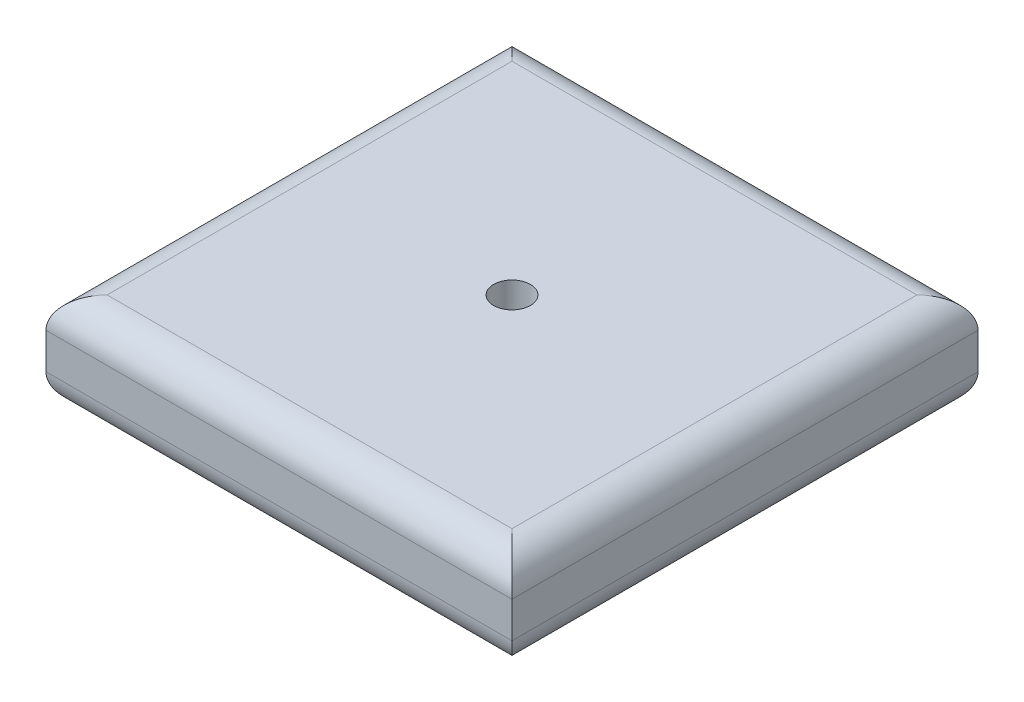
ISO-10303-21;
HEADER;
FILE_DESCRIPTION(('STEP AP214'),'2;1');
FILE_NAME('part.step','',(''),(''),'','','');
FILE_SCHEMA(('AUTOMOTIVE_DESIGN { 1 0 10303 214 1 1 1 1 }'));
ENDSEC;
DATA;
#1=APPLICATION_CONTEXT('core data for automotive mechanical design processes');
#2=APPLICATION_PROTOCOL_DEFINITION('international standard','automotive_design',2000,#1);
#3=PRODUCT_CONTEXT('',#1,'mechanical');
#4=PRODUCT('Part','Part','',(#3));
#5=PRODUCT_RELATED_PRODUCT_CATEGORY('part','',(#4));
#6=PRODUCT_DEFINITION_FORMATION('','',#4);
#7=PRODUCT_DEFINITION_CONTEXT('part definition',#1,'design');
#8=PRODUCT_DEFINITION('design','',#6,#7);
#9=PRODUCT_DEFINITION_SHAPE('','',#8);
#10=(LENGTH_UNIT() NAMED_UNIT(*) SI_UNIT(.MILLI.,.METRE.));
#11=(NAMED_UNIT(*) PLANE_ANGLE_UNIT() SI_UNIT($,.RADIAN.));
#12=(NAMED_UNIT(*) SI_UNIT($,.STERADIAN.) SOLID_ANGLE_UNIT());
#13=UNCERTAINTY_MEASURE_WITH_UNIT(LENGTH_MEASURE(1.E-05),#10,'distance_accuracy_value','');
#14=(GEOMETRIC_REPRESENTATION_CONTEXT(3) GLOBAL_UNCERTAINTY_ASSIGNED_CONTEXT((#13)) GLOBAL_UNIT_ASSIGNED_CONTEXT((#10,
#11,#12)) REPRESENTATION_CONTEXT('',''));
#15=CARTESIAN_POINT('',(0.,0.,0.));
#16=DIRECTION('',(0.,0.,1.));
#17=DIRECTION('',(1.,0.,0.));
#18=AXIS2_PLACEMENT_3D('',#15,#16,#17);
#19=CARTESIAN_POINT('',(-33.7530201342282,31.75,-152.4));
#20=DIRECTION('',(1.,0.,0.));
#21=DIRECTION('',(0.,0.,-1.));
#22=AXIS2_PLACEMENT_3D('',#19,#20,#21);
#23=PLANE('',#22);
#24=DIRECTION('',(0.,-1.,0.));
#25=VECTOR('',#24,1.);
#26=CARTESIAN_POINT('',(-33.7530201342282,31.75,-152.4));
#27=LINE('',#26,#25);
#28=CARTESIAN_POINT('',(-33.7530201342282,21.75,-152.4));
#29=VERTEX_POINT('',#28);
#30=CARTESIAN_POINT('',(-33.7530201342282,10.,-152.4));
#31=VERTEX_POINT('',#30);
#32=EDGE_CURVE('E222',#29,#31,#27,.T.);
#33=ORIENTED_EDGE('',*,*,#32,.T.);
#34=DIRECTION('',(0.,0.,1.));
#35=VECTOR('',#34,1.);
#36=CARTESIAN_POINT('',(-33.7530201342282,10.,-152.4));
#37=LINE('',#36,#35);
#38=CARTESIAN_POINT('',(-33.7530201342282,10.,0.));
#39=VERTEX_POINT('',#38);
#40=EDGE_CURVE('E64',#31,#39,#37,.T.);
#41=ORIENTED_EDGE('',*,*,#40,.T.);
#42=DIRECTION('',(0.,-1.,0.));
#43=VECTOR('',#42,1.);
#44=CARTESIAN_POINT('',(-33.7530201342282,31.75,0.));
#45=LINE('',#44,#43);
#46=CARTESIAN_POINT('',(-33.7530201342282,21.75,0.));
#47=VERTEX_POINT('',#46);
#48=EDGE_CURVE('E137',#47,#39,#45,.T.);
#49=ORIENTED_EDGE('',*,*,#48,.F.);
#50=DIRECTION('',(0.,0.,1.));
#51=VECTOR('',#50,1.);
#52=CARTESIAN_POINT('',(-33.7530201342282,21.75,-152.4));
#53=LINE('',#52,#51);
#54=EDGE_CURVE('E153',#47,#29,#53,.F.);
#55=ORIENTED_EDGE('',*,*,#54,.T.);
#56=EDGE_LOOP('',(#33,#41,#49,#55));
#57=FACE_BOUND('',#56,.T.);
#58=ADVANCED_FACE('F39',(#57),#23,.F.);
#59=CARTESIAN_POINT('',(-33.7530201342282,31.75,0.));
#60=DIRECTION('',(0.,0.,-1.));
#61=DIRECTION('',(-1.,0.,0.));
#62=AXIS2_PLACEMENT_3D('',#59,#60,#61);
#63=PLANE('',#62);
#64=ORIENTED_EDGE('',*,*,#48,.T.);
#65=DIRECTION('',(1.,0.,0.));
#66=VECTOR('',#65,1.);
#67=CARTESIAN_POINT('',(-33.7530201342282,10.,0.));
#68=LINE('',#67,#66);
#69=CARTESIAN_POINT('',(118.646979865772,10.,0.));
#70=VERTEX_POINT('',#69);
#71=EDGE_CURVE('E49',#39,#70,#68,.T.);
#72=ORIENTED_EDGE('',*,*,#71,.T.);
#73=DIRECTION('',(0.,-1.,0.));
#74=VECTOR('',#73,1.);
#75=CARTESIAN_POINT('',(118.646979865772,31.75,0.));
#76=LINE('',#75,#74);
#77=CARTESIAN_POINT('',(118.646979865772,21.75,0.));
#78=VERTEX_POINT('',#77);
#79=EDGE_CURVE('E140',#78,#70,#76,.T.);
#80=ORIENTED_EDGE('',*,*,#79,.F.);
#81=DIRECTION('',(1.,0.,0.));
#82=VECTOR('',#81,1.);
#83=CARTESIAN_POINT('',(-33.7530201342282,21.75,0.));
#84=LINE('',#83,#82);
#85=EDGE_CURVE('E126',#78,#47,#84,.F.);
#86=ORIENTED_EDGE('',*,*,#85,.T.);
#87=EDGE_LOOP('',(#64,#72,#80,#86));
#88=FACE_BOUND('',#87,.T.);
#89=ADVANCED_FACE('F239',(#88),#63,.F.);
#90=CARTESIAN_POINT('',(118.646979865772,31.75,-152.4));
#91=DIRECTION('',(-1.,0.,0.));
#92=DIRECTION('',(0.,0.,1.));
#93=AXIS2_PLACEMENT_3D('',#90,#91,#92);
#94=PLANE('',#93);
#95=ORIENTED_EDGE('',*,*,#79,.T.);
#96=DIRECTION('',(0.,0.,-1.));
#97=VECTOR('',#96,1.);
#98=CARTESIAN_POINT('',(118.646979865772,10.,-152.4));
#99=LINE('',#98,#97);
#100=CARTESIAN_POINT('',(118.646979865772,10.,-152.4));
#101=VERTEX_POINT('',#100);
#102=EDGE_CURVE('E11',#70,#101,#99,.T.);
#103=ORIENTED_EDGE('',*,*,#102,.T.);
#104=DIRECTION('',(0.,-1.,0.));
#105=VECTOR('',#104,1.);
#106=CARTESIAN_POINT('',(118.646979865772,31.75,-152.4));
#107=LINE('',#106,#105);
#108=CARTESIAN_POINT('',(118.646979865772,21.75,-152.4));
#109=VERTEX_POINT('',#108);
#110=EDGE_CURVE('E225',#109,#101,#107,.T.);
#111=ORIENTED_EDGE('',*,*,#110,.F.);
#112=DIRECTION('',(0.,0.,-1.));
#113=VECTOR('',#112,1.);
#114=CARTESIAN_POINT('',(118.646979865772,21.75,0.));
#115=LINE('',#114,#113);
#116=EDGE_CURVE('E158',#109,#78,#115,.F.);
#117=ORIENTED_EDGE('',*,*,#116,.T.);
#118=EDGE_LOOP('',(#95,#103,#111,#117));
#119=FACE_BOUND('',#118,.T.);
#120=ADVANCED_FACE('F238',(#119),#94,.F.);
#121=CARTESIAN_POINT('',(-33.7530201342282,31.75,-152.4));
#122=DIRECTION('',(0.,0.,1.));
#123=DIRECTION('',(1.,0.,0.));
#124=AXIS2_PLACEMENT_3D('',#121,#122,#123);
#125=PLANE('',#124);
#126=ORIENTED_EDGE('',*,*,#110,.T.);
#127=DIRECTION('',(-1.,0.,0.));
#128=VECTOR('',#127,1.);
#129=CARTESIAN_POINT('',(-33.7530201342282,10.,-152.4));
#130=LINE('',#129,#128);
#131=EDGE_CURVE('E161',#101,#31,#130,.T.);
#132=ORIENTED_EDGE('',*,*,#131,.T.);
#133=ORIENTED_EDGE('',*,*,#32,.F.);
#134=DIRECTION('',(-1.,0.,0.));
#135=VECTOR('',#134,1.);
#136=CARTESIAN_POINT('',(118.646979865772,21.75,-152.4));
#137=LINE('',#136,#135);
#138=EDGE_CURVE('E149',#29,#109,#137,.F.);
#139=ORIENTED_EDGE('',*,*,#138,.T.);
#140=EDGE_LOOP('',(#126,#132,#133,#139));
#141=FACE_BOUND('',#140,.T.);
#142=ADVANCED_FACE('F221',(#141),#125,.F.);
#143=CARTESIAN_POINT('',(0.,31.75,0.));
#144=DIRECTION('',(0.,1.,0.));
#145=DIRECTION('',(0.,0.,1.));
#146=AXIS2_PLACEMENT_3D('',#143,#144,#145);
#147=PLANE('',#146);
#148=DIRECTION('',(0.,0.,-1.));
#149=VECTOR('',#148,1.);
#150=CARTESIAN_POINT('',(108.646979865772,31.75,-152.4));
#151=LINE('',#150,#149);
#152=CARTESIAN_POINT('',(108.646979865772,31.75,-10.));
#153=VERTEX_POINT('',#152);
#154=CARTESIAN_POINT('',(108.646979865772,31.75,-142.4));
#155=VERTEX_POINT('',#154);
#156=EDGE_CURVE('E113',#153,#155,#151,.T.);
#157=ORIENTED_EDGE('',*,*,#156,.T.);
#158=DIRECTION('',(-1.,0.,0.));
#159=VECTOR('',#158,1.);
#160=CARTESIAN_POINT('',(-33.7530201342282,31.75,-142.4));
#161=LINE('',#160,#159);
#162=CARTESIAN_POINT('',(-23.7530201342282,31.75,-142.4));
#163=VERTEX_POINT('',#162);
#164=EDGE_CURVE('E146',#155,#163,#161,.T.);
#165=ORIENTED_EDGE('',*,*,#164,.T.);
#166=DIRECTION('',(0.,0.,1.));
#167=VECTOR('',#166,1.);
#168=CARTESIAN_POINT('',(-23.7530201342281,31.75,0.));
#169=LINE('',#168,#167);
#170=CARTESIAN_POINT('',(-23.7530201342281,31.75,-10.));
#171=VERTEX_POINT('',#170);
#172=EDGE_CURVE('E116',#163,#171,#169,.T.);
#173=ORIENTED_EDGE('',*,*,#172,.T.);
#174=DIRECTION('',(1.,0.,0.));
#175=VECTOR('',#174,1.);
#176=CARTESIAN_POINT('',(118.646979865772,31.75,-10.));
#177=LINE('',#176,#175);
#178=EDGE_CURVE('E107',#171,#153,#177,.T.);
#179=ORIENTED_EDGE('',*,*,#178,.T.);
#180=EDGE_LOOP('',(#157,#165,#173,#179));
#181=FACE_BOUND('',#180,.T.);
#182=CARTESIAN_POINT('',(42.4469798657718,31.75,-76.2));
#183=DIRECTION('',(0.,1.,0.));
#184=DIRECTION('',(0.,0.,1.));
#185=AXIS2_PLACEMENT_3D('',#182,#183,#184);
#186=CIRCLE('',#185,6.);
#187=CARTESIAN_POINT('',(42.4469798657718,31.75,-70.2));
#188=VERTEX_POINT('',#187);
#189=EDGE_CURVE('E130',#188,#188,#186,.T.);
#190=ORIENTED_EDGE('',*,*,#189,.F.);
#191=EDGE_LOOP('',(#190));
#192=FACE_BOUND('',#191,.T.);
#193=ADVANCED_FACE('F109',(#181,#192),#147,.T.);
#194=CARTESIAN_POINT('',(0.,0.,0.));
#195=DIRECTION('',(0.,1.,0.));
#196=DIRECTION('',(0.,0.,1.));
#197=AXIS2_PLACEMENT_3D('',#194,#195,#196);
#198=PLANE('',#197);
#199=DIRECTION('',(0.,0.,1.));
#200=VECTOR('',#199,1.);
#201=CARTESIAN_POINT('',(-23.7530201342281,0.,0.));
#202=LINE('',#201,#200);
#203=CARTESIAN_POINT('',(-23.7530201342281,0.,-10.));
#204=VERTEX_POINT('',#203);
#205=CARTESIAN_POINT('',(-23.7530201342282,0.,-142.4));
#206=VERTEX_POINT('',#205);
#207=EDGE_CURVE('E178',#204,#206,#202,.F.);
#208=ORIENTED_EDGE('',*,*,#207,.T.);
#209=DIRECTION('',(-1.,0.,0.));
#210=VECTOR('',#209,1.);
#211=CARTESIAN_POINT('',(0.,0.,-142.4));
#212=LINE('',#211,#210);
#213=CARTESIAN_POINT('',(108.646979865772,0.,-142.4));
#214=VERTEX_POINT('',#213);
#215=EDGE_CURVE('E181',#206,#214,#212,.F.);
#216=ORIENTED_EDGE('',*,*,#215,.T.);
#217=DIRECTION('',(0.,0.,-1.));
#218=VECTOR('',#217,1.);
#219=CARTESIAN_POINT('',(108.646979865772,0.,0.));
#220=LINE('',#219,#218);
#221=CARTESIAN_POINT('',(108.646979865772,0.,-10.));
#222=VERTEX_POINT('',#221);
#223=EDGE_CURVE('E172',#214,#222,#220,.F.);
#224=ORIENTED_EDGE('',*,*,#223,.T.);
#225=DIRECTION('',(1.,0.,0.));
#226=VECTOR('',#225,1.);
#227=CARTESIAN_POINT('',(0.,0.,-10.));
#228=LINE('',#227,#226);
#229=EDGE_CURVE('E175',#222,#204,#228,.F.);
#230=ORIENTED_EDGE('',*,*,#229,.T.);
#231=EDGE_LOOP('',(#208,#216,#224,#230));
#232=FACE_BOUND('',#231,.T.);
#233=ADVANCED_FACE('F211',(#232),#198,.F.);
#234=CARTESIAN_POINT('',(42.4469798657718,16.75,-76.2));
#235=DIRECTION('',(0.,1.,0.));
#236=DIRECTION('',(0.,0.,1.));
#237=AXIS2_PLACEMENT_3D('',#234,#235,#236);
#238=CYLINDRICAL_SURFACE('',#237,6.);
#239=CARTESIAN_POINT('',(42.4469798657718,16.75,-76.2));
#240=DIRECTION('',(0.,1.,0.));
#241=DIRECTION('',(0.,0.,1.));
#242=AXIS2_PLACEMENT_3D('',#239,#240,#241);
#243=CIRCLE('',#242,6.);
#244=CARTESIAN_POINT('',(42.4469798657718,16.75,-70.2));
#245=VERTEX_POINT('',#244);
#246=EDGE_CURVE('E228',#245,#245,#243,.T.);
#247=ORIENTED_EDGE('',*,*,#246,.F.);
#248=EDGE_LOOP('',(#247));
#249=FACE_BOUND('',#248,.T.);
#250=ORIENTED_EDGE('',*,*,#189,.T.);
#251=EDGE_LOOP('',(#250));
#252=FACE_BOUND('',#251,.T.);
#253=ADVANCED_FACE('F265',(#249,#252),#238,.F.);
#254=CARTESIAN_POINT('',(42.4469798657718,16.75,-76.2));
#255=DIRECTION('',(0.,1.,0.));
#256=DIRECTION('',(0.,0.,1.));
#257=AXIS2_PLACEMENT_3D('',#254,#255,#256);
#258=PLANE('',#257);
#259=ORIENTED_EDGE('',*,*,#246,.T.);
#260=EDGE_LOOP('',(#259));
#261=FACE_BOUND('',#260,.T.);
#262=ADVANCED_FACE('F270',(#261),#258,.T.);
#263=CARTESIAN_POINT('',(0.,21.75,-10.));
#264=DIRECTION('',(-1.,0.,0.));
#265=DIRECTION('',(0.,0.,1.));
#266=AXIS2_PLACEMENT_3D('',#263,#264,#265);
#267=CYLINDRICAL_SURFACE('',#266,10.);
#268=CARTESIAN_POINT('',(-23.7530201342281,21.75,-10.));
#269=DIRECTION('',(-0.707106781186547,0.,-0.707106781186547));
#270=DIRECTION('',(-0.707106781186547,0.,0.707106781186548));
#271=AXIS2_PLACEMENT_3D('',#268,#269,#270);
#272=ELLIPSE('',#271,14.1421356237309,10.);
#273=EDGE_CURVE('E131',#47,#171,#272,.T.);
#274=ORIENTED_EDGE('',*,*,#273,.F.);
#275=ORIENTED_EDGE('',*,*,#85,.F.);
#276=CARTESIAN_POINT('',(108.646979865772,21.75,-10.));
#277=DIRECTION('',(-0.707106781186547,0.,0.707106781186547));
#278=DIRECTION('',(0.707106781186547,0.,0.707106781186547));
#279=AXIS2_PLACEMENT_3D('',#276,#277,#278);
#280=ELLIPSE('',#279,14.1421356237309,10.);
#281=EDGE_CURVE('E124',#153,#78,#280,.F.);
#282=ORIENTED_EDGE('',*,*,#281,.F.);
#283=ORIENTED_EDGE('',*,*,#178,.F.);
#284=EDGE_LOOP('',(#274,#275,#282,#283));
#285=FACE_BOUND('',#284,.T.);
#286=ADVANCED_FACE('F125',(#285),#267,.T.);
#287=CARTESIAN_POINT('',(108.646979865772,21.75,0.));
#288=DIRECTION('',(0.,0.,1.));
#289=DIRECTION('',(1.,0.,0.));
#290=AXIS2_PLACEMENT_3D('',#287,#288,#289);
#291=CYLINDRICAL_SURFACE('',#290,10.);
#292=ORIENTED_EDGE('',*,*,#281,.T.);
#293=ORIENTED_EDGE('',*,*,#116,.F.);
#294=CARTESIAN_POINT('',(108.646979865772,21.75,-142.4));
#295=DIRECTION('',(0.707106781186547,0.,0.707106781186547));
#296=DIRECTION('',(-0.707106781186547,0.,0.707106781186547));
#297=AXIS2_PLACEMENT_3D('',#294,#295,#296);
#298=ELLIPSE('',#297,14.1421356237309,10.);
#299=EDGE_CURVE('E134',#155,#109,#298,.F.);
#300=ORIENTED_EDGE('',*,*,#299,.F.);
#301=ORIENTED_EDGE('',*,*,#156,.F.);
#302=EDGE_LOOP('',(#292,#293,#300,#301));
#303=FACE_BOUND('',#302,.T.);
#304=ADVANCED_FACE('F133',(#303),#291,.T.);
#305=CARTESIAN_POINT('',(-23.7530201342281,21.75,0.));
#306=DIRECTION('',(0.,0.,-1.));
#307=DIRECTION('',(-1.,0.,0.));
#308=AXIS2_PLACEMENT_3D('',#305,#306,#307);
#309=CYLINDRICAL_SURFACE('',#308,10.);
#310=ORIENTED_EDGE('',*,*,#273,.T.);
#311=ORIENTED_EDGE('',*,*,#172,.F.);
#312=CARTESIAN_POINT('',(-23.7530201342282,21.75,-142.4));
#313=DIRECTION('',(0.707106781186547,0.,-0.707106781186548));
#314=DIRECTION('',(-0.707106781186547,0.,-0.707106781186547));
#315=AXIS2_PLACEMENT_3D('',#312,#313,#314);
#316=ELLIPSE('',#315,14.142135623731,10.);
#317=EDGE_CURVE('E162',#29,#163,#316,.T.);
#318=ORIENTED_EDGE('',*,*,#317,.F.);
#319=ORIENTED_EDGE('',*,*,#54,.F.);
#320=EDGE_LOOP('',(#310,#311,#318,#319));
#321=FACE_BOUND('',#320,.T.);
#322=ADVANCED_FACE('F242',(#321),#309,.T.);
#323=CARTESIAN_POINT('',(0.,21.75,-142.4));
#324=DIRECTION('',(1.,0.,0.));
#325=DIRECTION('',(0.,0.,-1.));
#326=AXIS2_PLACEMENT_3D('',#323,#324,#325);
#327=CYLINDRICAL_SURFACE('',#326,10.);
#328=ORIENTED_EDGE('',*,*,#299,.T.);
#329=ORIENTED_EDGE('',*,*,#138,.F.);
#330=ORIENTED_EDGE('',*,*,#317,.T.);
#331=ORIENTED_EDGE('',*,*,#164,.F.);
#332=EDGE_LOOP('',(#328,#329,#330,#331));
#333=FACE_BOUND('',#332,.T.);
#334=ADVANCED_FACE('F244',(#333),#327,.T.);
#335=CARTESIAN_POINT('',(-33.7530201342282,10.,-10.));
#336=DIRECTION('',(1.,0.,0.));
#337=DIRECTION('',(0.,0.,-1.));
#338=AXIS2_PLACEMENT_3D('',#335,#336,#337);
#339=CYLINDRICAL_SURFACE('',#338,10.);
#340=CARTESIAN_POINT('',(-23.7530201342281,10.,-10.));
#341=DIRECTION('',(0.707106781186547,0.,0.707106781186547));
#342=DIRECTION('',(0.707106781186547,0.,-0.707106781186548));
#343=AXIS2_PLACEMENT_3D('',#340,#341,#342);
#344=ELLIPSE('',#343,14.1421356237309,10.);
#345=EDGE_CURVE('E194',#204,#39,#344,.F.);
#346=ORIENTED_EDGE('',*,*,#345,.F.);
#347=ORIENTED_EDGE('',*,*,#229,.F.);
#348=CARTESIAN_POINT('',(108.646979865772,10.,-10.));
#349=DIRECTION('',(0.707106781186547,0.,-0.707106781186547));
#350=DIRECTION('',(-0.707106781186547,0.,-0.707106781186547));
#351=AXIS2_PLACEMENT_3D('',#348,#349,#350);
#352=ELLIPSE('',#351,14.1421356237309,10.);
#353=EDGE_CURVE('E43',#70,#222,#352,.T.);
#354=ORIENTED_EDGE('',*,*,#353,.F.);
#355=ORIENTED_EDGE('',*,*,#71,.F.);
#356=EDGE_LOOP('',(#346,#347,#354,#355));
#357=FACE_BOUND('',#356,.T.);
#358=ADVANCED_FACE('F41',(#357),#339,.T.);
#359=CARTESIAN_POINT('',(108.646979865772,10.,-152.4));
#360=DIRECTION('',(0.,0.,-1.));
#361=DIRECTION('',(-1.,0.,0.));
#362=AXIS2_PLACEMENT_3D('',#359,#360,#361);
#363=CYLINDRICAL_SURFACE('',#362,10.);
#364=ORIENTED_EDGE('',*,*,#353,.T.);
#365=ORIENTED_EDGE('',*,*,#223,.F.);
#366=CARTESIAN_POINT('',(108.646979865772,10.,-142.4));
#367=DIRECTION('',(-0.707106781186547,0.,-0.707106781186547));
#368=DIRECTION('',(0.707106781186547,0.,-0.707106781186547));
#369=AXIS2_PLACEMENT_3D('',#366,#367,#368);
#370=ELLIPSE('',#369,14.1421356237309,10.);
#371=EDGE_CURVE('E192',#101,#214,#370,.T.);
#372=ORIENTED_EDGE('',*,*,#371,.F.);
#373=ORIENTED_EDGE('',*,*,#102,.F.);
#374=EDGE_LOOP('',(#364,#365,#372,#373));
#375=FACE_BOUND('',#374,.T.);
#376=ADVANCED_FACE('F206',(#375),#363,.T.);
#377=CARTESIAN_POINT('',(-23.7530201342282,10.,-152.4));
#378=DIRECTION('',(0.,0.,1.));
#379=DIRECTION('',(1.,0.,0.));
#380=AXIS2_PLACEMENT_3D('',#377,#378,#379);
#381=CYLINDRICAL_SURFACE('',#380,10.);
#382=ORIENTED_EDGE('',*,*,#345,.T.);
#383=ORIENTED_EDGE('',*,*,#40,.F.);
#384=CARTESIAN_POINT('',(-23.7530201342282,10.,-142.4));
#385=DIRECTION('',(-0.707106781186547,0.,0.707106781186548));
#386=DIRECTION('',(0.707106781186547,0.,0.707106781186547));
#387=AXIS2_PLACEMENT_3D('',#384,#385,#386);
#388=ELLIPSE('',#387,14.142135623731,10.);
#389=EDGE_CURVE('E189',#206,#31,#388,.F.);
#390=ORIENTED_EDGE('',*,*,#389,.F.);
#391=ORIENTED_EDGE('',*,*,#207,.F.);
#392=EDGE_LOOP('',(#382,#383,#390,#391));
#393=FACE_BOUND('',#392,.T.);
#394=ADVANCED_FACE('F217',(#393),#381,.T.);
#395=CARTESIAN_POINT('',(-33.7530201342282,10.,-142.4));
#396=DIRECTION('',(-1.,0.,0.));
#397=DIRECTION('',(0.,0.,1.));
#398=AXIS2_PLACEMENT_3D('',#395,#396,#397);
#399=CYLINDRICAL_SURFACE('',#398,10.);
#400=ORIENTED_EDGE('',*,*,#371,.T.);
#401=ORIENTED_EDGE('',*,*,#215,.F.);
#402=ORIENTED_EDGE('',*,*,#389,.T.);
#403=ORIENTED_EDGE('',*,*,#131,.F.);
#404=EDGE_LOOP('',(#400,#401,#402,#403));
#405=FACE_BOUND('',#404,.T.);
#406=ADVANCED_FACE('F215',(#405),#399,.T.);
#407=CLOSED_SHELL('',(#58,#89,#120,#142,#193,#233,#253,#262,#286,#304,#322,#334,#358,#376,#394,#406));
#408=MANIFOLD_SOLID_BREP('B2',#407);
#409=ADVANCED_BREP_SHAPE_REPRESENTATION('',(#18,#408),#14);
#410=SHAPE_DEFINITION_REPRESENTATION(#9,#409);
ENDSEC;
END-ISO-10303-21;
